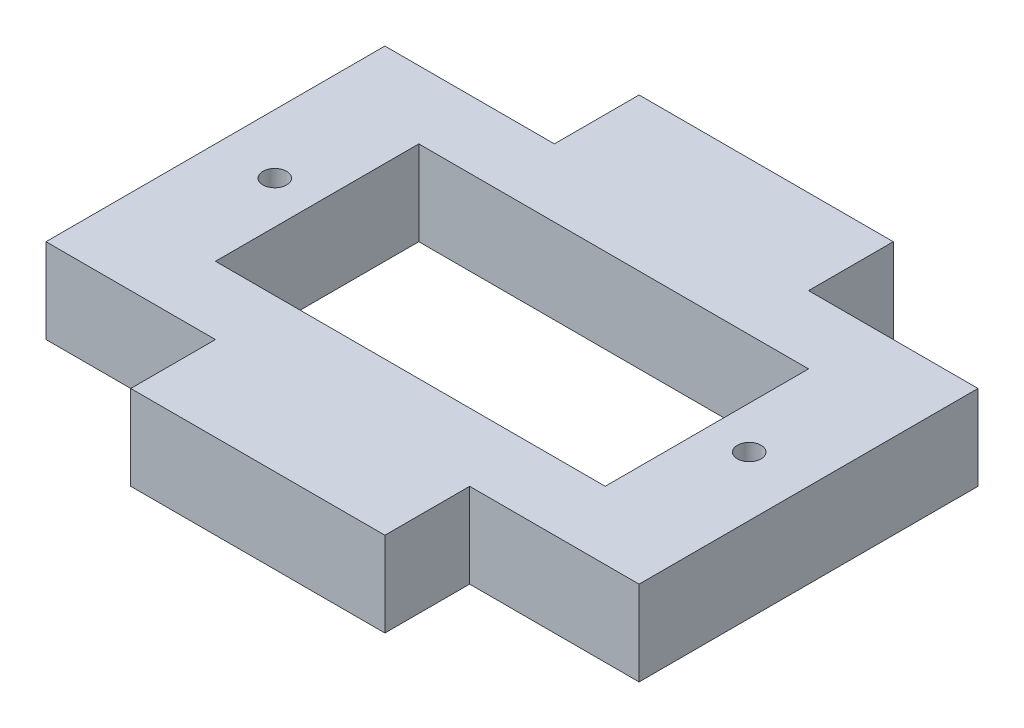
ISO-10303-21;
HEADER;
FILE_DESCRIPTION(('STEP AP214'),'2;1');
FILE_NAME('part.step','',(''),(''),'','','');
FILE_SCHEMA(('AUTOMOTIVE_DESIGN { 1 0 10303 214 1 1 1 1 }'));
ENDSEC;
DATA;
#1=APPLICATION_CONTEXT('core data for automotive mechanical design processes');
#2=APPLICATION_PROTOCOL_DEFINITION('international standard','automotive_design',2000,#1);
#3=PRODUCT_CONTEXT('',#1,'mechanical');
#4=PRODUCT('Part','Part','',(#3));
#5=PRODUCT_RELATED_PRODUCT_CATEGORY('part','',(#4));
#6=PRODUCT_DEFINITION_FORMATION('','',#4);
#7=PRODUCT_DEFINITION_CONTEXT('part definition',#1,'design');
#8=PRODUCT_DEFINITION('design','',#6,#7);
#9=PRODUCT_DEFINITION_SHAPE('','',#8);
#10=(LENGTH_UNIT() NAMED_UNIT(*) SI_UNIT(.MILLI.,.METRE.));
#11=(NAMED_UNIT(*) PLANE_ANGLE_UNIT() SI_UNIT($,.RADIAN.));
#12=(NAMED_UNIT(*) SI_UNIT($,.STERADIAN.) SOLID_ANGLE_UNIT());
#13=UNCERTAINTY_MEASURE_WITH_UNIT(LENGTH_MEASURE(1.E-05),#10,'distance_accuracy_value','');
#14=(GEOMETRIC_REPRESENTATION_CONTEXT(3) GLOBAL_UNCERTAINTY_ASSIGNED_CONTEXT((#13)) GLOBAL_UNIT_ASSIGNED_CONTEXT((#10,
#11,#12)) REPRESENTATION_CONTEXT('',''));
#15=CARTESIAN_POINT('',(0.,0.,0.));
#16=DIRECTION('',(0.,0.,1.));
#17=DIRECTION('',(1.,0.,0.));
#18=AXIS2_PLACEMENT_3D('',#15,#16,#17);
#19=CARTESIAN_POINT('',(0.,5.,0.));
#20=DIRECTION('',(0.,-1.,0.));
#21=DIRECTION('',(0.,0.,-1.));
#22=AXIS2_PLACEMENT_3D('',#19,#20,#21);
#23=PLANE('',#22);
#24=CARTESIAN_POINT('',(14.,5.,0.));
#25=DIRECTION('',(0.,1.,0.));
#26=DIRECTION('',(0.,0.,1.));
#27=AXIS2_PLACEMENT_3D('',#24,#25,#26);
#28=CIRCLE('',#27,0.7);
#29=CARTESIAN_POINT('',(14.,5.,0.7));
#30=VERTEX_POINT('',#29);
#31=EDGE_CURVE('E201',#30,#30,#28,.T.);
#32=ORIENTED_EDGE('',*,*,#31,.F.);
#33=EDGE_LOOP('',(#32));
#34=FACE_BOUND('',#33,.T.);
#35=CARTESIAN_POINT('',(-14.,5.,0.));
#36=DIRECTION('',(0.,1.,0.));
#37=DIRECTION('',(0.,0.,1.));
#38=AXIS2_PLACEMENT_3D('',#35,#36,#37);
#39=CIRCLE('',#38,0.7);
#40=CARTESIAN_POINT('',(-14.,5.,0.7));
#41=VERTEX_POINT('',#40);
#42=EDGE_CURVE('E209',#41,#41,#39,.T.);
#43=ORIENTED_EDGE('',*,*,#42,.F.);
#44=EDGE_LOOP('',(#43));
#45=FACE_BOUND('',#44,.T.);
#46=DIRECTION('',(0.,0.,-1.));
#47=VECTOR('',#46,1.);
#48=CARTESIAN_POINT('',(17.5,5.,10.));
#49=LINE('',#48,#47);
#50=CARTESIAN_POINT('',(17.5,5.,10.));
#51=VERTEX_POINT('',#50);
#52=CARTESIAN_POINT('',(17.5,5.,-10.));
#53=VERTEX_POINT('',#52);
#54=EDGE_CURVE('E217',#51,#53,#49,.T.);
#55=ORIENTED_EDGE('',*,*,#54,.T.);
#56=DIRECTION('',(-1.,0.,0.));
#57=VECTOR('',#56,1.);
#58=CARTESIAN_POINT('',(7.5,5.,-10.));
#59=LINE('',#58,#57);
#60=CARTESIAN_POINT('',(7.5,5.,-10.));
#61=VERTEX_POINT('',#60);
#62=EDGE_CURVE('E221',#53,#61,#59,.T.);
#63=ORIENTED_EDGE('',*,*,#62,.T.);
#64=DIRECTION('',(0.,0.,-1.));
#65=VECTOR('',#64,1.);
#66=CARTESIAN_POINT('',(7.5,5.,-10.));
#67=LINE('',#66,#65);
#68=CARTESIAN_POINT('',(7.5,5.,-15.));
#69=VERTEX_POINT('',#68);
#70=EDGE_CURVE('E225',#61,#69,#67,.T.);
#71=ORIENTED_EDGE('',*,*,#70,.T.);
#72=DIRECTION('',(-1.,0.,0.));
#73=VECTOR('',#72,1.);
#74=CARTESIAN_POINT('',(-7.5,5.,-15.));
#75=LINE('',#74,#73);
#76=CARTESIAN_POINT('',(-7.5,5.,-15.));
#77=VERTEX_POINT('',#76);
#78=EDGE_CURVE('E228',#69,#77,#75,.T.);
#79=ORIENTED_EDGE('',*,*,#78,.T.);
#80=DIRECTION('',(0.,0.,1.));
#81=VECTOR('',#80,1.);
#82=CARTESIAN_POINT('',(-7.5,5.,-10.));
#83=LINE('',#82,#81);
#84=CARTESIAN_POINT('',(-7.5,5.,-10.));
#85=VERTEX_POINT('',#84);
#86=EDGE_CURVE('E231',#77,#85,#83,.T.);
#87=ORIENTED_EDGE('',*,*,#86,.T.);
#88=DIRECTION('',(-1.,0.,0.));
#89=VECTOR('',#88,1.);
#90=CARTESIAN_POINT('',(-17.5,5.,-10.));
#91=LINE('',#90,#89);
#92=CARTESIAN_POINT('',(-17.5,5.,-10.));
#93=VERTEX_POINT('',#92);
#94=EDGE_CURVE('E234',#85,#93,#91,.T.);
#95=ORIENTED_EDGE('',*,*,#94,.T.);
#96=DIRECTION('',(0.,0.,1.));
#97=VECTOR('',#96,1.);
#98=CARTESIAN_POINT('',(-17.5,5.,10.));
#99=LINE('',#98,#97);
#100=CARTESIAN_POINT('',(-17.5,5.,10.));
#101=VERTEX_POINT('',#100);
#102=EDGE_CURVE('E237',#93,#101,#99,.T.);
#103=ORIENTED_EDGE('',*,*,#102,.T.);
#104=DIRECTION('',(1.,0.,0.));
#105=VECTOR('',#104,1.);
#106=CARTESIAN_POINT('',(-17.5,5.,10.));
#107=LINE('',#106,#105);
#108=CARTESIAN_POINT('',(-7.5,5.,10.));
#109=VERTEX_POINT('',#108);
#110=EDGE_CURVE('E240',#101,#109,#107,.T.);
#111=ORIENTED_EDGE('',*,*,#110,.T.);
#112=DIRECTION('',(0.,0.,1.));
#113=VECTOR('',#112,1.);
#114=CARTESIAN_POINT('',(-7.5,5.,10.));
#115=LINE('',#114,#113);
#116=CARTESIAN_POINT('',(-7.5,5.,15.));
#117=VERTEX_POINT('',#116);
#118=EDGE_CURVE('E243',#109,#117,#115,.T.);
#119=ORIENTED_EDGE('',*,*,#118,.T.);
#120=DIRECTION('',(1.,0.,0.));
#121=VECTOR('',#120,1.);
#122=CARTESIAN_POINT('',(-7.5,5.,15.));
#123=LINE('',#122,#121);
#124=CARTESIAN_POINT('',(7.5,5.,15.));
#125=VERTEX_POINT('',#124);
#126=EDGE_CURVE('E246',#117,#125,#123,.T.);
#127=ORIENTED_EDGE('',*,*,#126,.T.);
#128=DIRECTION('',(0.,0.,-1.));
#129=VECTOR('',#128,1.);
#130=CARTESIAN_POINT('',(7.5,5.,10.));
#131=LINE('',#130,#129);
#132=CARTESIAN_POINT('',(7.5,5.,10.));
#133=VERTEX_POINT('',#132);
#134=EDGE_CURVE('E249',#125,#133,#131,.T.);
#135=ORIENTED_EDGE('',*,*,#134,.T.);
#136=DIRECTION('',(1.,0.,0.));
#137=VECTOR('',#136,1.);
#138=CARTESIAN_POINT('',(7.5,5.,10.));
#139=LINE('',#138,#137);
#140=EDGE_CURVE('E252',#133,#51,#139,.T.);
#141=ORIENTED_EDGE('',*,*,#140,.T.);
#142=EDGE_LOOP('',(#55,#63,#71,#79,#87,#95,#103,#111,#119,#127,#135,#141));
#143=FACE_BOUND('',#142,.T.);
#144=DIRECTION('',(0.,0.,-1.));
#145=VECTOR('',#144,1.);
#146=CARTESIAN_POINT('',(11.5,5.,6.));
#147=LINE('',#146,#145);
#148=CARTESIAN_POINT('',(11.5,5.,6.));
#149=VERTEX_POINT('',#148);
#150=CARTESIAN_POINT('',(11.5,5.,-6.));
#151=VERTEX_POINT('',#150);
#152=EDGE_CURVE('E153',#149,#151,#147,.T.);
#153=ORIENTED_EDGE('',*,*,#152,.F.);
#154=DIRECTION('',(1.,0.,0.));
#155=VECTOR('',#154,1.);
#156=CARTESIAN_POINT('',(-11.5,5.,6.));
#157=LINE('',#156,#155);
#158=CARTESIAN_POINT('',(-11.5,5.,6.));
#159=VERTEX_POINT('',#158);
#160=EDGE_CURVE('E179',#159,#149,#157,.T.);
#161=ORIENTED_EDGE('',*,*,#160,.F.);
#162=DIRECTION('',(0.,0.,1.));
#163=VECTOR('',#162,1.);
#164=CARTESIAN_POINT('',(-11.5,5.,6.));
#165=LINE('',#164,#163);
#166=CARTESIAN_POINT('',(-11.5,5.,-6.));
#167=VERTEX_POINT('',#166);
#168=EDGE_CURVE('E175',#167,#159,#165,.T.);
#169=ORIENTED_EDGE('',*,*,#168,.F.);
#170=DIRECTION('',(-1.,0.,0.));
#171=VECTOR('',#170,1.);
#172=CARTESIAN_POINT('',(-11.5,5.,-6.));
#173=LINE('',#172,#171);
#174=EDGE_CURVE('E162',#151,#167,#173,.T.);
#175=ORIENTED_EDGE('',*,*,#174,.F.);
#176=EDGE_LOOP('',(#153,#161,#169,#175));
#177=FACE_BOUND('',#176,.T.);
#178=ADVANCED_FACE('F39',(#34,#45,#143,#177),#23,.F.);
#179=CARTESIAN_POINT('',(0.,0.,0.));
#180=DIRECTION('',(0.,-1.,0.));
#181=DIRECTION('',(0.,0.,-1.));
#182=AXIS2_PLACEMENT_3D('',#179,#180,#181);
#183=PLANE('',#182);
#184=CARTESIAN_POINT('',(-14.,0.,0.));
#185=DIRECTION('',(0.,1.,0.));
#186=DIRECTION('',(0.,0.,1.));
#187=AXIS2_PLACEMENT_3D('',#184,#185,#186);
#188=CIRCLE('',#187,0.7);
#189=CARTESIAN_POINT('',(-14.,0.,0.7));
#190=VERTEX_POINT('',#189);
#191=EDGE_CURVE('E205',#190,#190,#188,.T.);
#192=ORIENTED_EDGE('',*,*,#191,.T.);
#193=EDGE_LOOP('',(#192));
#194=FACE_BOUND('',#193,.T.);
#195=DIRECTION('',(0.,0.,-1.));
#196=VECTOR('',#195,1.);
#197=CARTESIAN_POINT('',(17.5,0.,10.));
#198=LINE('',#197,#196);
#199=CARTESIAN_POINT('',(17.5,0.,10.));
#200=VERTEX_POINT('',#199);
#201=CARTESIAN_POINT('',(17.5,0.,-10.));
#202=VERTEX_POINT('',#201);
#203=EDGE_CURVE('E213',#200,#202,#198,.T.);
#204=ORIENTED_EDGE('',*,*,#203,.F.);
#205=DIRECTION('',(1.,0.,0.));
#206=VECTOR('',#205,1.);
#207=CARTESIAN_POINT('',(7.5,0.,10.));
#208=LINE('',#207,#206);
#209=CARTESIAN_POINT('',(7.5,0.,10.));
#210=VERTEX_POINT('',#209);
#211=EDGE_CURVE('E222',#210,#200,#208,.T.);
#212=ORIENTED_EDGE('',*,*,#211,.F.);
#213=DIRECTION('',(0.,0.,-1.));
#214=VECTOR('',#213,1.);
#215=CARTESIAN_POINT('',(7.5,0.,10.));
#216=LINE('',#215,#214);
#217=CARTESIAN_POINT('',(7.5,0.,15.));
#218=VERTEX_POINT('',#217);
#219=EDGE_CURVE('E286',#218,#210,#216,.T.);
#220=ORIENTED_EDGE('',*,*,#219,.F.);
#221=DIRECTION('',(1.,0.,0.));
#222=VECTOR('',#221,1.);
#223=CARTESIAN_POINT('',(-7.5,0.,15.));
#224=LINE('',#223,#222);
#225=CARTESIAN_POINT('',(-7.5,0.,15.));
#226=VERTEX_POINT('',#225);
#227=EDGE_CURVE('E283',#226,#218,#224,.T.);
#228=ORIENTED_EDGE('',*,*,#227,.F.);
#229=DIRECTION('',(0.,0.,1.));
#230=VECTOR('',#229,1.);
#231=CARTESIAN_POINT('',(-7.5,0.,10.));
#232=LINE('',#231,#230);
#233=CARTESIAN_POINT('',(-7.5,0.,10.));
#234=VERTEX_POINT('',#233);
#235=EDGE_CURVE('E280',#234,#226,#232,.T.);
#236=ORIENTED_EDGE('',*,*,#235,.F.);
#237=DIRECTION('',(1.,0.,0.));
#238=VECTOR('',#237,1.);
#239=CARTESIAN_POINT('',(-17.5,0.,10.));
#240=LINE('',#239,#238);
#241=CARTESIAN_POINT('',(-17.5,0.,10.));
#242=VERTEX_POINT('',#241);
#243=EDGE_CURVE('E277',#242,#234,#240,.T.);
#244=ORIENTED_EDGE('',*,*,#243,.F.);
#245=DIRECTION('',(0.,0.,1.));
#246=VECTOR('',#245,1.);
#247=CARTESIAN_POINT('',(-17.5,0.,10.));
#248=LINE('',#247,#246);
#249=CARTESIAN_POINT('',(-17.5,0.,-10.));
#250=VERTEX_POINT('',#249);
#251=EDGE_CURVE('E274',#250,#242,#248,.T.);
#252=ORIENTED_EDGE('',*,*,#251,.F.);
#253=DIRECTION('',(-1.,0.,0.));
#254=VECTOR('',#253,1.);
#255=CARTESIAN_POINT('',(-17.5,0.,-10.));
#256=LINE('',#255,#254);
#257=CARTESIAN_POINT('',(-7.5,0.,-10.));
#258=VERTEX_POINT('',#257);
#259=EDGE_CURVE('E271',#258,#250,#256,.T.);
#260=ORIENTED_EDGE('',*,*,#259,.F.);
#261=DIRECTION('',(0.,0.,1.));
#262=VECTOR('',#261,1.);
#263=CARTESIAN_POINT('',(-7.5,0.,-10.));
#264=LINE('',#263,#262);
#265=CARTESIAN_POINT('',(-7.5,0.,-15.));
#266=VERTEX_POINT('',#265);
#267=EDGE_CURVE('E268',#266,#258,#264,.T.);
#268=ORIENTED_EDGE('',*,*,#267,.F.);
#269=DIRECTION('',(-1.,0.,0.));
#270=VECTOR('',#269,1.);
#271=CARTESIAN_POINT('',(-7.5,0.,-15.));
#272=LINE('',#271,#270);
#273=CARTESIAN_POINT('',(7.5,0.,-15.));
#274=VERTEX_POINT('',#273);
#275=EDGE_CURVE('E265',#274,#266,#272,.T.);
#276=ORIENTED_EDGE('',*,*,#275,.F.);
#277=DIRECTION('',(0.,0.,-1.));
#278=VECTOR('',#277,1.);
#279=CARTESIAN_POINT('',(7.5,0.,-10.));
#280=LINE('',#279,#278);
#281=CARTESIAN_POINT('',(7.5,0.,-10.));
#282=VERTEX_POINT('',#281);
#283=EDGE_CURVE('E262',#282,#274,#280,.T.);
#284=ORIENTED_EDGE('',*,*,#283,.F.);
#285=DIRECTION('',(-1.,0.,0.));
#286=VECTOR('',#285,1.);
#287=CARTESIAN_POINT('',(7.5,0.,-10.));
#288=LINE('',#287,#286);
#289=EDGE_CURVE('E259',#202,#282,#288,.T.);
#290=ORIENTED_EDGE('',*,*,#289,.F.);
#291=EDGE_LOOP('',(#204,#212,#220,#228,#236,#244,#252,#260,#268,#276,#284,#290));
#292=FACE_BOUND('',#291,.T.);
#293=CARTESIAN_POINT('',(14.,0.,0.));
#294=DIRECTION('',(0.,1.,0.));
#295=DIRECTION('',(0.,0.,1.));
#296=AXIS2_PLACEMENT_3D('',#293,#294,#295);
#297=CIRCLE('',#296,0.7);
#298=CARTESIAN_POINT('',(14.,0.,0.7));
#299=VERTEX_POINT('',#298);
#300=EDGE_CURVE('E171',#299,#299,#297,.T.);
#301=ORIENTED_EDGE('',*,*,#300,.T.);
#302=EDGE_LOOP('',(#301));
#303=FACE_BOUND('',#302,.T.);
#304=DIRECTION('',(1.,0.,0.));
#305=VECTOR('',#304,1.);
#306=CARTESIAN_POINT('',(-11.5,0.,6.));
#307=LINE('',#306,#305);
#308=CARTESIAN_POINT('',(-11.5,0.,6.));
#309=VERTEX_POINT('',#308);
#310=CARTESIAN_POINT('',(11.5,0.,6.));
#311=VERTEX_POINT('',#310);
#312=EDGE_CURVE('E163',#309,#311,#307,.T.);
#313=ORIENTED_EDGE('',*,*,#312,.T.);
#314=DIRECTION('',(0.,0.,-1.));
#315=VECTOR('',#314,1.);
#316=CARTESIAN_POINT('',(11.5,0.,6.));
#317=LINE('',#316,#315);
#318=CARTESIAN_POINT('',(11.5,0.,-6.));
#319=VERTEX_POINT('',#318);
#320=EDGE_CURVE('E63',#311,#319,#317,.T.);
#321=ORIENTED_EDGE('',*,*,#320,.T.);
#322=DIRECTION('',(-1.,0.,0.));
#323=VECTOR('',#322,1.);
#324=CARTESIAN_POINT('',(-11.5,0.,-6.));
#325=LINE('',#324,#323);
#326=CARTESIAN_POINT('',(-11.5,0.,-6.));
#327=VERTEX_POINT('',#326);
#328=EDGE_CURVE('E169',#319,#327,#325,.T.);
#329=ORIENTED_EDGE('',*,*,#328,.T.);
#330=DIRECTION('',(0.,0.,1.));
#331=VECTOR('',#330,1.);
#332=CARTESIAN_POINT('',(-11.5,0.,6.));
#333=LINE('',#332,#331);
#334=EDGE_CURVE('E188',#327,#309,#333,.T.);
#335=ORIENTED_EDGE('',*,*,#334,.T.);
#336=EDGE_LOOP('',(#313,#321,#329,#335));
#337=FACE_BOUND('',#336,.T.);
#338=ADVANCED_FACE('F341',(#194,#292,#303,#337),#183,.T.);
#339=CARTESIAN_POINT('',(17.5,5.,10.));
#340=DIRECTION('',(-1.,0.,0.));
#341=DIRECTION('',(0.,0.,1.));
#342=AXIS2_PLACEMENT_3D('',#339,#340,#341);
#343=PLANE('',#342);
#344=ORIENTED_EDGE('',*,*,#203,.T.);
#345=DIRECTION('',(0.,-1.,0.));
#346=VECTOR('',#345,1.);
#347=CARTESIAN_POINT('',(17.5,5.,-10.));
#348=LINE('',#347,#346);
#349=EDGE_CURVE('E11',#53,#202,#348,.T.);
#350=ORIENTED_EDGE('',*,*,#349,.F.);
#351=ORIENTED_EDGE('',*,*,#54,.F.);
#352=DIRECTION('',(0.,-1.,0.));
#353=VECTOR('',#352,1.);
#354=CARTESIAN_POINT('',(17.5,5.,10.));
#355=LINE('',#354,#353);
#356=EDGE_CURVE('E255',#51,#200,#355,.T.);
#357=ORIENTED_EDGE('',*,*,#356,.T.);
#358=EDGE_LOOP('',(#344,#350,#351,#357));
#359=FACE_BOUND('',#358,.T.);
#360=ADVANCED_FACE('F41',(#359),#343,.F.);
#361=CARTESIAN_POINT('',(7.5,5.,-10.));
#362=DIRECTION('',(0.,0.,1.));
#363=DIRECTION('',(1.,0.,0.));
#364=AXIS2_PLACEMENT_3D('',#361,#362,#363);
#365=PLANE('',#364);
#366=ORIENTED_EDGE('',*,*,#289,.T.);
#367=DIRECTION('',(0.,-1.,0.));
#368=VECTOR('',#367,1.);
#369=CARTESIAN_POINT('',(7.5,5.,-10.));
#370=LINE('',#369,#368);
#371=EDGE_CURVE('E48',#61,#282,#370,.T.);
#372=ORIENTED_EDGE('',*,*,#371,.F.);
#373=ORIENTED_EDGE('',*,*,#62,.F.);
#374=ORIENTED_EDGE('',*,*,#349,.T.);
#375=EDGE_LOOP('',(#366,#372,#373,#374));
#376=FACE_BOUND('',#375,.T.);
#377=ADVANCED_FACE('F358',(#376),#365,.F.);
#378=CARTESIAN_POINT('',(7.5,5.,-10.));
#379=DIRECTION('',(-1.,0.,0.));
#380=DIRECTION('',(0.,0.,1.));
#381=AXIS2_PLACEMENT_3D('',#378,#379,#380);
#382=PLANE('',#381);
#383=ORIENTED_EDGE('',*,*,#283,.T.);
#384=DIRECTION('',(0.,-1.,0.));
#385=VECTOR('',#384,1.);
#386=CARTESIAN_POINT('',(7.5,5.,-15.));
#387=LINE('',#386,#385);
#388=EDGE_CURVE('E326',#69,#274,#387,.T.);
#389=ORIENTED_EDGE('',*,*,#388,.F.);
#390=ORIENTED_EDGE('',*,*,#70,.F.);
#391=ORIENTED_EDGE('',*,*,#371,.T.);
#392=EDGE_LOOP('',(#383,#389,#390,#391));
#393=FACE_BOUND('',#392,.T.);
#394=ADVANCED_FACE('F335',(#393),#382,.F.);
#395=CARTESIAN_POINT('',(-7.5,5.,-15.));
#396=DIRECTION('',(0.,0.,1.));
#397=DIRECTION('',(1.,0.,0.));
#398=AXIS2_PLACEMENT_3D('',#395,#396,#397);
#399=PLANE('',#398);
#400=ORIENTED_EDGE('',*,*,#275,.T.);
#401=DIRECTION('',(0.,-1.,0.));
#402=VECTOR('',#401,1.);
#403=CARTESIAN_POINT('',(-7.5,5.,-15.));
#404=LINE('',#403,#402);
#405=EDGE_CURVE('E322',#77,#266,#404,.T.);
#406=ORIENTED_EDGE('',*,*,#405,.F.);
#407=ORIENTED_EDGE('',*,*,#78,.F.);
#408=ORIENTED_EDGE('',*,*,#388,.T.);
#409=EDGE_LOOP('',(#400,#406,#407,#408));
#410=FACE_BOUND('',#409,.T.);
#411=ADVANCED_FACE('F347',(#410),#399,.F.);
#412=CARTESIAN_POINT('',(-7.5,5.,-10.));
#413=DIRECTION('',(1.,0.,0.));
#414=DIRECTION('',(0.,0.,-1.));
#415=AXIS2_PLACEMENT_3D('',#412,#413,#414);
#416=PLANE('',#415);
#417=ORIENTED_EDGE('',*,*,#267,.T.);
#418=DIRECTION('',(0.,-1.,0.));
#419=VECTOR('',#418,1.);
#420=CARTESIAN_POINT('',(-7.5,5.,-10.));
#421=LINE('',#420,#419);
#422=EDGE_CURVE('E318',#85,#258,#421,.T.);
#423=ORIENTED_EDGE('',*,*,#422,.F.);
#424=ORIENTED_EDGE('',*,*,#86,.F.);
#425=ORIENTED_EDGE('',*,*,#405,.T.);
#426=EDGE_LOOP('',(#417,#423,#424,#425));
#427=FACE_BOUND('',#426,.T.);
#428=ADVANCED_FACE('F351',(#427),#416,.F.);
#429=CARTESIAN_POINT('',(-17.5,5.,-10.));
#430=DIRECTION('',(0.,0.,1.));
#431=DIRECTION('',(1.,0.,0.));
#432=AXIS2_PLACEMENT_3D('',#429,#430,#431);
#433=PLANE('',#432);
#434=ORIENTED_EDGE('',*,*,#259,.T.);
#435=DIRECTION('',(0.,-1.,0.));
#436=VECTOR('',#435,1.);
#437=CARTESIAN_POINT('',(-17.5,5.,-10.));
#438=LINE('',#437,#436);
#439=EDGE_CURVE('E314',#93,#250,#438,.T.);
#440=ORIENTED_EDGE('',*,*,#439,.F.);
#441=ORIENTED_EDGE('',*,*,#94,.F.);
#442=ORIENTED_EDGE('',*,*,#422,.T.);
#443=EDGE_LOOP('',(#434,#440,#441,#442));
#444=FACE_BOUND('',#443,.T.);
#445=ADVANCED_FACE('F391',(#444),#433,.F.);
#446=CARTESIAN_POINT('',(-17.5,5.,10.));
#447=DIRECTION('',(1.,0.,0.));
#448=DIRECTION('',(0.,0.,-1.));
#449=AXIS2_PLACEMENT_3D('',#446,#447,#448);
#450=PLANE('',#449);
#451=ORIENTED_EDGE('',*,*,#251,.T.);
#452=DIRECTION('',(0.,-1.,0.));
#453=VECTOR('',#452,1.);
#454=CARTESIAN_POINT('',(-17.5,5.,10.));
#455=LINE('',#454,#453);
#456=EDGE_CURVE('E310',#101,#242,#455,.T.);
#457=ORIENTED_EDGE('',*,*,#456,.F.);
#458=ORIENTED_EDGE('',*,*,#102,.F.);
#459=ORIENTED_EDGE('',*,*,#439,.T.);
#460=EDGE_LOOP('',(#451,#457,#458,#459));
#461=FACE_BOUND('',#460,.T.);
#462=ADVANCED_FACE('F389',(#461),#450,.F.);
#463=CARTESIAN_POINT('',(-17.5,5.,10.));
#464=DIRECTION('',(0.,0.,-1.));
#465=DIRECTION('',(-1.,0.,0.));
#466=AXIS2_PLACEMENT_3D('',#463,#464,#465);
#467=PLANE('',#466);
#468=ORIENTED_EDGE('',*,*,#243,.T.);
#469=DIRECTION('',(0.,-1.,0.));
#470=VECTOR('',#469,1.);
#471=CARTESIAN_POINT('',(-7.5,5.,10.));
#472=LINE('',#471,#470);
#473=EDGE_CURVE('E306',#109,#234,#472,.T.);
#474=ORIENTED_EDGE('',*,*,#473,.F.);
#475=ORIENTED_EDGE('',*,*,#110,.F.);
#476=ORIENTED_EDGE('',*,*,#456,.T.);
#477=EDGE_LOOP('',(#468,#474,#475,#476));
#478=FACE_BOUND('',#477,.T.);
#479=ADVANCED_FACE('F385',(#478),#467,.F.);
#480=CARTESIAN_POINT('',(-7.5,5.,10.));
#481=DIRECTION('',(1.,0.,0.));
#482=DIRECTION('',(0.,0.,-1.));
#483=AXIS2_PLACEMENT_3D('',#480,#481,#482);
#484=PLANE('',#483);
#485=ORIENTED_EDGE('',*,*,#235,.T.);
#486=DIRECTION('',(0.,-1.,0.));
#487=VECTOR('',#486,1.);
#488=CARTESIAN_POINT('',(-7.5,5.,15.));
#489=LINE('',#488,#487);
#490=EDGE_CURVE('E302',#117,#226,#489,.T.);
#491=ORIENTED_EDGE('',*,*,#490,.F.);
#492=ORIENTED_EDGE('',*,*,#118,.F.);
#493=ORIENTED_EDGE('',*,*,#473,.T.);
#494=EDGE_LOOP('',(#485,#491,#492,#493));
#495=FACE_BOUND('',#494,.T.);
#496=ADVANCED_FACE('F380',(#495),#484,.F.);
#497=CARTESIAN_POINT('',(-7.5,5.,15.));
#498=DIRECTION('',(0.,0.,-1.));
#499=DIRECTION('',(-1.,0.,0.));
#500=AXIS2_PLACEMENT_3D('',#497,#498,#499);
#501=PLANE('',#500);
#502=ORIENTED_EDGE('',*,*,#227,.T.);
#503=DIRECTION('',(0.,-1.,0.));
#504=VECTOR('',#503,1.);
#505=CARTESIAN_POINT('',(7.5,5.,15.));
#506=LINE('',#505,#504);
#507=EDGE_CURVE('E298',#125,#218,#506,.T.);
#508=ORIENTED_EDGE('',*,*,#507,.F.);
#509=ORIENTED_EDGE('',*,*,#126,.F.);
#510=ORIENTED_EDGE('',*,*,#490,.T.);
#511=EDGE_LOOP('',(#502,#508,#509,#510));
#512=FACE_BOUND('',#511,.T.);
#513=ADVANCED_FACE('F374',(#512),#501,.F.);
#514=CARTESIAN_POINT('',(7.5,5.,10.));
#515=DIRECTION('',(-1.,0.,0.));
#516=DIRECTION('',(0.,0.,1.));
#517=AXIS2_PLACEMENT_3D('',#514,#515,#516);
#518=PLANE('',#517);
#519=ORIENTED_EDGE('',*,*,#219,.T.);
#520=DIRECTION('',(0.,-1.,0.));
#521=VECTOR('',#520,1.);
#522=CARTESIAN_POINT('',(7.5,5.,10.));
#523=LINE('',#522,#521);
#524=EDGE_CURVE('E294',#133,#210,#523,.T.);
#525=ORIENTED_EDGE('',*,*,#524,.F.);
#526=ORIENTED_EDGE('',*,*,#134,.F.);
#527=ORIENTED_EDGE('',*,*,#507,.T.);
#528=EDGE_LOOP('',(#519,#525,#526,#527));
#529=FACE_BOUND('',#528,.T.);
#530=ADVANCED_FACE('F370',(#529),#518,.F.);
#531=CARTESIAN_POINT('',(7.5,5.,10.));
#532=DIRECTION('',(0.,0.,-1.));
#533=DIRECTION('',(-1.,0.,0.));
#534=AXIS2_PLACEMENT_3D('',#531,#532,#533);
#535=PLANE('',#534);
#536=ORIENTED_EDGE('',*,*,#211,.T.);
#537=ORIENTED_EDGE('',*,*,#356,.F.);
#538=ORIENTED_EDGE('',*,*,#140,.F.);
#539=ORIENTED_EDGE('',*,*,#524,.T.);
#540=EDGE_LOOP('',(#536,#537,#538,#539));
#541=FACE_BOUND('',#540,.T.);
#542=ADVANCED_FACE('F365',(#541),#535,.F.);
#543=CARTESIAN_POINT('',(-14.,5.,0.));
#544=DIRECTION('',(0.,-1.,0.));
#545=DIRECTION('',(0.,0.,-1.));
#546=AXIS2_PLACEMENT_3D('',#543,#544,#545);
#547=CYLINDRICAL_SURFACE('',#546,0.7);
#548=ORIENTED_EDGE('',*,*,#42,.T.);
#549=EDGE_LOOP('',(#548));
#550=FACE_BOUND('',#549,.T.);
#551=ORIENTED_EDGE('',*,*,#191,.F.);
#552=EDGE_LOOP('',(#551));
#553=FACE_BOUND('',#552,.T.);
#554=ADVANCED_FACE('F411',(#550,#553),#547,.F.);
#555=CARTESIAN_POINT('',(14.,5.,0.));
#556=DIRECTION('',(0.,-1.,0.));
#557=DIRECTION('',(0.,0.,-1.));
#558=AXIS2_PLACEMENT_3D('',#555,#556,#557);
#559=CYLINDRICAL_SURFACE('',#558,0.7);
#560=ORIENTED_EDGE('',*,*,#31,.T.);
#561=EDGE_LOOP('',(#560));
#562=FACE_BOUND('',#561,.T.);
#563=ORIENTED_EDGE('',*,*,#300,.F.);
#564=EDGE_LOOP('',(#563));
#565=FACE_BOUND('',#564,.T.);
#566=ADVANCED_FACE('F449',(#562,#565),#559,.F.);
#567=CARTESIAN_POINT('',(11.5,5.,6.));
#568=DIRECTION('',(-1.,0.,0.));
#569=DIRECTION('',(0.,0.,1.));
#570=AXIS2_PLACEMENT_3D('',#567,#568,#569);
#571=PLANE('',#570);
#572=ORIENTED_EDGE('',*,*,#320,.F.);
#573=DIRECTION('',(0.,-1.,0.));
#574=VECTOR('',#573,1.);
#575=CARTESIAN_POINT('',(11.5,5.,6.));
#576=LINE('',#575,#574);
#577=EDGE_CURVE('E157',#149,#311,#576,.T.);
#578=ORIENTED_EDGE('',*,*,#577,.F.);
#579=ORIENTED_EDGE('',*,*,#152,.T.);
#580=DIRECTION('',(0.,-1.,0.));
#581=VECTOR('',#580,1.);
#582=CARTESIAN_POINT('',(11.5,5.,-6.));
#583=LINE('',#582,#581);
#584=EDGE_CURVE('E156',#151,#319,#583,.T.);
#585=ORIENTED_EDGE('',*,*,#584,.T.);
#586=EDGE_LOOP('',(#572,#578,#579,#585));
#587=FACE_BOUND('',#586,.T.);
#588=ADVANCED_FACE('F155',(#587),#571,.T.);
#589=CARTESIAN_POINT('',(-11.5,5.,-6.));
#590=DIRECTION('',(0.,0.,1.));
#591=DIRECTION('',(1.,0.,0.));
#592=AXIS2_PLACEMENT_3D('',#589,#590,#591);
#593=PLANE('',#592);
#594=ORIENTED_EDGE('',*,*,#328,.F.);
#595=ORIENTED_EDGE('',*,*,#584,.F.);
#596=ORIENTED_EDGE('',*,*,#174,.T.);
#597=DIRECTION('',(0.,-1.,0.));
#598=VECTOR('',#597,1.);
#599=CARTESIAN_POINT('',(-11.5,5.,-6.));
#600=LINE('',#599,#598);
#601=EDGE_CURVE('E172',#167,#327,#600,.T.);
#602=ORIENTED_EDGE('',*,*,#601,.T.);
#603=EDGE_LOOP('',(#594,#595,#596,#602));
#604=FACE_BOUND('',#603,.T.);
#605=ADVANCED_FACE('F166',(#604),#593,.T.);
#606=CARTESIAN_POINT('',(-11.5,5.,6.));
#607=DIRECTION('',(1.,0.,0.));
#608=DIRECTION('',(0.,0.,-1.));
#609=AXIS2_PLACEMENT_3D('',#606,#607,#608);
#610=PLANE('',#609);
#611=ORIENTED_EDGE('',*,*,#334,.F.);
#612=ORIENTED_EDGE('',*,*,#601,.F.);
#613=ORIENTED_EDGE('',*,*,#168,.T.);
#614=DIRECTION('',(0.,-1.,0.));
#615=VECTOR('',#614,1.);
#616=CARTESIAN_POINT('',(-11.5,5.,6.));
#617=LINE('',#616,#615);
#618=EDGE_CURVE('E55',#159,#309,#617,.T.);
#619=ORIENTED_EDGE('',*,*,#618,.T.);
#620=EDGE_LOOP('',(#611,#612,#613,#619));
#621=FACE_BOUND('',#620,.T.);
#622=ADVANCED_FACE('F468',(#621),#610,.T.);
#623=CARTESIAN_POINT('',(-11.5,5.,6.));
#624=DIRECTION('',(0.,0.,-1.));
#625=DIRECTION('',(-1.,0.,0.));
#626=AXIS2_PLACEMENT_3D('',#623,#624,#625);
#627=PLANE('',#626);
#628=ORIENTED_EDGE('',*,*,#312,.F.);
#629=ORIENTED_EDGE('',*,*,#618,.F.);
#630=ORIENTED_EDGE('',*,*,#160,.T.);
#631=ORIENTED_EDGE('',*,*,#577,.T.);
#632=EDGE_LOOP('',(#628,#629,#630,#631));
#633=FACE_BOUND('',#632,.T.);
#634=ADVANCED_FACE('F475',(#633),#627,.T.);
#635=CLOSED_SHELL('',(#178,#338,#360,#377,#394,#411,#428,#445,#462,#479,#496,#513,#530,#542,
#554,#566,#588,#605,#622,#634));
#636=MANIFOLD_SOLID_BREP('B2',#635);
#637=ADVANCED_BREP_SHAPE_REPRESENTATION('',(#18,#636),#14);
#638=SHAPE_DEFINITION_REPRESENTATION(#9,#637);
ENDSEC;
END-ISO-10303-21;
